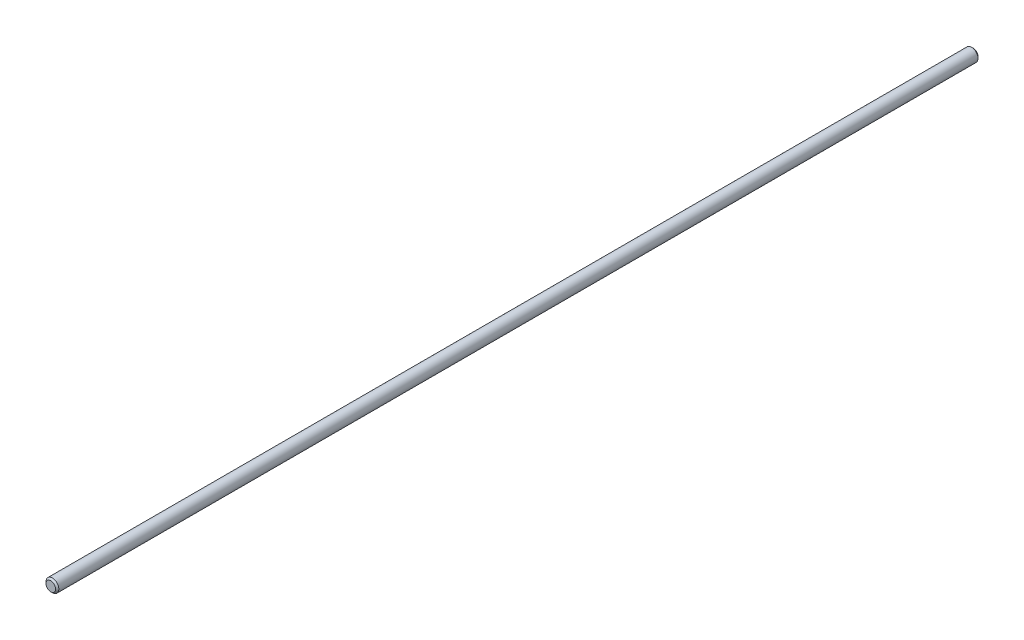
ISO-10303-21;
HEADER;
FILE_DESCRIPTION(('STEP AP214'),'2;1');
FILE_NAME('part.step','',(''),(''),'','','');
FILE_SCHEMA(('AUTOMOTIVE_DESIGN { 1 0 10303 214 1 1 1 1 }'));
ENDSEC;
DATA;
#1=APPLICATION_CONTEXT('core data for automotive mechanical design processes');
#2=APPLICATION_PROTOCOL_DEFINITION('international standard','automotive_design',2000,#1);
#3=PRODUCT_CONTEXT('',#1,'mechanical');
#4=PRODUCT('Part','Part','',(#3));
#5=PRODUCT_RELATED_PRODUCT_CATEGORY('part','',(#4));
#6=PRODUCT_DEFINITION_FORMATION('','',#4);
#7=PRODUCT_DEFINITION_CONTEXT('part definition',#1,'design');
#8=PRODUCT_DEFINITION('design','',#6,#7);
#9=PRODUCT_DEFINITION_SHAPE('','',#8);
#10=(LENGTH_UNIT() NAMED_UNIT(*) SI_UNIT(.MILLI.,.METRE.));
#11=(NAMED_UNIT(*) PLANE_ANGLE_UNIT() SI_UNIT($,.RADIAN.));
#12=(NAMED_UNIT(*) SI_UNIT($,.STERADIAN.) SOLID_ANGLE_UNIT());
#13=UNCERTAINTY_MEASURE_WITH_UNIT(LENGTH_MEASURE(1.E-05),#10,'distance_accuracy_value','');
#14=(GEOMETRIC_REPRESENTATION_CONTEXT(3) GLOBAL_UNCERTAINTY_ASSIGNED_CONTEXT((#13)) GLOBAL_UNIT_ASSIGNED_CONTEXT((#10,
#11,#12)) REPRESENTATION_CONTEXT('',''));
#15=CARTESIAN_POINT('',(0.,0.,0.));
#16=DIRECTION('',(0.,0.,1.));
#17=DIRECTION('',(1.,0.,0.));
#18=AXIS2_PLACEMENT_3D('',#15,#16,#17);
#19=CARTESIAN_POINT('',(0.,0.,288.));
#20=DIRECTION('',(0.,0.,1.));
#21=DIRECTION('',(1.,0.,0.));
#22=AXIS2_PLACEMENT_3D('',#19,#20,#21);
#23=PLANE('',#22);
#24=CARTESIAN_POINT('',(0.,0.,288.000000000068));
#25=DIRECTION('',(0.,0.,-1.));
#26=DIRECTION('',(-1.,0.,0.));
#27=AXIS2_PLACEMENT_3D('',#24,#25,#26);
#28=CIRCLE('',#27,1.49999999996453);
#29=CARTESIAN_POINT('',(-1.49999999996453,0.,288.000000000068));
#30=VERTEX_POINT('',#29);
#31=EDGE_CURVE('E18',#30,#30,#28,.T.);
#32=ORIENTED_EDGE('',*,*,#31,.F.);
#33=EDGE_LOOP('',(#32));
#34=FACE_BOUND('',#33,.T.);
#35=ADVANCED_FACE('F15',(#34),#23,.T.);
#36=CARTESIAN_POINT('',(0.,0.,0.));
#37=DIRECTION('',(0.,0.,1.));
#38=DIRECTION('',(1.,0.,0.));
#39=AXIS2_PLACEMENT_3D('',#36,#37,#38);
#40=PLANE('',#39);
#41=CARTESIAN_POINT('',(0.,0.,0.));
#42=DIRECTION('',(0.,0.,1.));
#43=DIRECTION('',(1.,0.,0.));
#44=AXIS2_PLACEMENT_3D('',#41,#42,#43);
#45=CIRCLE('',#44,1.49999999996453);
#46=CARTESIAN_POINT('',(1.49999999996453,0.,0.));
#47=VERTEX_POINT('',#46);
#48=EDGE_CURVE('E27',#47,#47,#45,.T.);
#49=ORIENTED_EDGE('',*,*,#48,.F.);
#50=EDGE_LOOP('',(#49));
#51=FACE_BOUND('',#50,.T.);
#52=ADVANCED_FACE('F38',(#51),#40,.F.);
#53=CARTESIAN_POINT('',(0.,0.,287.500000000136));
#54=DIRECTION('',(0.,0.,-1.));
#55=DIRECTION('',(-1.,0.,0.));
#56=AXIS2_PLACEMENT_3D('',#53,#54,#55);
#57=CONICAL_SURFACE('',#56,1.99999999989586,0.785398163397448);
#58=CARTESIAN_POINT('',(0.,0.,287.5));
#59=DIRECTION('',(0.,0.,-1.));
#60=DIRECTION('',(-1.,0.,0.));
#61=AXIS2_PLACEMENT_3D('',#58,#59,#60);
#62=CIRCLE('',#61,2.);
#63=CARTESIAN_POINT('',(-2.,0.,287.5));
#64=VERTEX_POINT('',#63);
#65=EDGE_CURVE('E22',#64,#64,#62,.T.);
#66=ORIENTED_EDGE('',*,*,#65,.F.);
#67=EDGE_LOOP('',(#66));
#68=FACE_BOUND('',#67,.T.);
#69=ORIENTED_EDGE('',*,*,#31,.T.);
#70=EDGE_LOOP('',(#69));
#71=FACE_BOUND('',#70,.T.);
#72=ADVANCED_FACE('F35',(#68,#71),#57,.T.);
#73=CARTESIAN_POINT('',(0.,0.,0.499999999988177));
#74=DIRECTION('',(0.,0.,1.));
#75=DIRECTION('',(1.,0.,0.));
#76=AXIS2_PLACEMENT_3D('',#73,#74,#75);
#77=CONICAL_SURFACE('',#76,2.00000000000955,0.785398163454292);
#78=CARTESIAN_POINT('',(0.,0.,0.5));
#79=DIRECTION('',(0.,0.,-1.));
#80=DIRECTION('',(-1.,0.,0.));
#81=AXIS2_PLACEMENT_3D('',#78,#79,#80);
#82=CIRCLE('',#81,2.);
#83=CARTESIAN_POINT('',(-2.,0.,0.5));
#84=VERTEX_POINT('',#83);
#85=EDGE_CURVE('E9',#84,#84,#82,.F.);
#86=ORIENTED_EDGE('',*,*,#85,.F.);
#87=EDGE_LOOP('',(#86));
#88=FACE_BOUND('',#87,.T.);
#89=ORIENTED_EDGE('',*,*,#48,.T.);
#90=EDGE_LOOP('',(#89));
#91=FACE_BOUND('',#90,.T.);
#92=ADVANCED_FACE('F45',(#88,#91),#77,.T.);
#93=CARTESIAN_POINT('',(0.,0.,288.));
#94=DIRECTION('',(0.,0.,-1.));
#95=DIRECTION('',(-1.,0.,0.));
#96=AXIS2_PLACEMENT_3D('',#93,#94,#95);
#97=CYLINDRICAL_SURFACE('',#96,2.);
#98=ORIENTED_EDGE('',*,*,#85,.T.);
#99=EDGE_LOOP('',(#98));
#100=FACE_BOUND('',#99,.T.);
#101=ORIENTED_EDGE('',*,*,#65,.T.);
#102=EDGE_LOOP('',(#101));
#103=FACE_BOUND('',#102,.T.);
#104=ADVANCED_FACE('F43',(#100,#103),#97,.T.);
#105=CLOSED_SHELL('',(#35,#52,#72,#92,#104));
#106=MANIFOLD_SOLID_BREP('B1',#105);
#107=ADVANCED_BREP_SHAPE_REPRESENTATION('',(#18,#106),#14);
#108=SHAPE_DEFINITION_REPRESENTATION(#9,#107);
ENDSEC;
END-ISO-10303-21;
